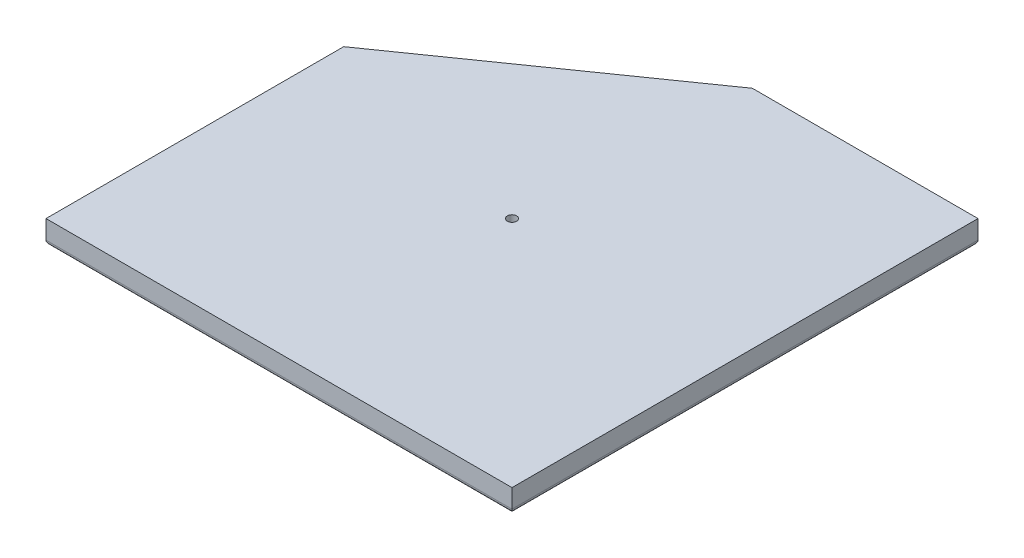
ISO-10303-21;
HEADER;
FILE_DESCRIPTION(('STEP AP214'),'2;1');
FILE_NAME('part.step','',(''),(''),'','','');
FILE_SCHEMA(('AUTOMOTIVE_DESIGN { 1 0 10303 214 1 1 1 1 }'));
ENDSEC;
DATA;
#1=APPLICATION_CONTEXT('core data for automotive mechanical design processes');
#2=APPLICATION_PROTOCOL_DEFINITION('international standard','automotive_design',2000,#1);
#3=PRODUCT_CONTEXT('',#1,'mechanical');
#4=PRODUCT('Part','Part','',(#3));
#5=PRODUCT_RELATED_PRODUCT_CATEGORY('part','',(#4));
#6=PRODUCT_DEFINITION_FORMATION('','',#4);
#7=PRODUCT_DEFINITION_CONTEXT('part definition',#1,'design');
#8=PRODUCT_DEFINITION('design','',#6,#7);
#9=PRODUCT_DEFINITION_SHAPE('','',#8);
#10=(LENGTH_UNIT() NAMED_UNIT(*) SI_UNIT(.MILLI.,.METRE.));
#11=(NAMED_UNIT(*) PLANE_ANGLE_UNIT() SI_UNIT($,.RADIAN.));
#12=(NAMED_UNIT(*) SI_UNIT($,.STERADIAN.) SOLID_ANGLE_UNIT());
#13=UNCERTAINTY_MEASURE_WITH_UNIT(LENGTH_MEASURE(1.E-05),#10,'distance_accuracy_value','');
#14=(GEOMETRIC_REPRESENTATION_CONTEXT(3) GLOBAL_UNCERTAINTY_ASSIGNED_CONTEXT((#13)) GLOBAL_UNIT_ASSIGNED_CONTEXT((#10,
#11,#12)) REPRESENTATION_CONTEXT('',''));
#15=CARTESIAN_POINT('',(0.,0.,0.));
#16=DIRECTION('',(0.,0.,1.));
#17=DIRECTION('',(1.,0.,0.));
#18=AXIS2_PLACEMENT_3D('',#15,#16,#17);
#19=CARTESIAN_POINT('',(0.,5.,0.));
#20=DIRECTION('',(1.,0.,0.));
#21=DIRECTION('',(0.,0.,-1.));
#22=AXIS2_PLACEMENT_3D('',#19,#20,#21);
#23=PLANE('',#22);
#24=DIRECTION('',(0.,-1.,0.));
#25=VECTOR('',#24,1.);
#26=CARTESIAN_POINT('',(0.,5.,-63.88575015));
#27=LINE('',#26,#25);
#28=CARTESIAN_POINT('',(0.,5.,-63.88575015));
#29=VERTEX_POINT('',#28);
#30=CARTESIAN_POINT('',(0.,1.,-63.88575015));
#31=VERTEX_POINT('',#30);
#32=EDGE_CURVE('E181',#29,#31,#27,.T.);
#33=ORIENTED_EDGE('',*,*,#32,.T.);
#34=DIRECTION('',(0.,0.,1.));
#35=VECTOR('',#34,1.);
#36=CARTESIAN_POINT('',(0.,1.,0.));
#37=LINE('',#36,#35);
#38=CARTESIAN_POINT('',(0.,1.,0.));
#39=VERTEX_POINT('',#38);
#40=EDGE_CURVE('E131',#31,#39,#37,.T.);
#41=ORIENTED_EDGE('',*,*,#40,.T.);
#42=DIRECTION('',(0.,-1.,0.));
#43=VECTOR('',#42,1.);
#44=CARTESIAN_POINT('',(0.,5.,0.));
#45=LINE('',#44,#43);
#46=CARTESIAN_POINT('',(0.,5.,0.));
#47=VERTEX_POINT('',#46);
#48=EDGE_CURVE('E113',#47,#39,#45,.T.);
#49=ORIENTED_EDGE('',*,*,#48,.F.);
#50=DIRECTION('',(0.,0.,1.));
#51=VECTOR('',#50,1.);
#52=CARTESIAN_POINT('',(0.,5.,0.));
#53=LINE('',#52,#51);
#54=EDGE_CURVE('E118',#29,#47,#53,.T.);
#55=ORIENTED_EDGE('',*,*,#54,.F.);
#56=EDGE_LOOP('',(#33,#41,#49,#55));
#57=FACE_BOUND('',#56,.T.);
#58=ADVANCED_FACE('F44',(#57),#23,.F.);
#59=CARTESIAN_POINT('',(0.,5.,0.));
#60=DIRECTION('',(0.,0.,-1.));
#61=DIRECTION('',(-1.,0.,0.));
#62=AXIS2_PLACEMENT_3D('',#59,#60,#61);
#63=PLANE('',#62);
#64=ORIENTED_EDGE('',*,*,#48,.T.);
#65=DIRECTION('',(1.,0.,0.));
#66=VECTOR('',#65,1.);
#67=CARTESIAN_POINT('',(0.,1.,0.));
#68=LINE('',#67,#66);
#69=CARTESIAN_POINT('',(100.,1.,0.));
#70=VERTEX_POINT('',#69);
#71=EDGE_CURVE('E149',#39,#70,#68,.T.);
#72=ORIENTED_EDGE('',*,*,#71,.T.);
#73=DIRECTION('',(0.,-1.,0.));
#74=VECTOR('',#73,1.);
#75=CARTESIAN_POINT('',(100.,5.,0.));
#76=LINE('',#75,#74);
#77=CARTESIAN_POINT('',(100.,5.,0.));
#78=VERTEX_POINT('',#77);
#79=EDGE_CURVE('E114',#78,#70,#76,.T.);
#80=ORIENTED_EDGE('',*,*,#79,.F.);
#81=DIRECTION('',(1.,0.,0.));
#82=VECTOR('',#81,1.);
#83=CARTESIAN_POINT('',(0.,5.,0.));
#84=LINE('',#83,#82);
#85=EDGE_CURVE('E109',#47,#78,#84,.T.);
#86=ORIENTED_EDGE('',*,*,#85,.F.);
#87=EDGE_LOOP('',(#64,#72,#80,#86));
#88=FACE_BOUND('',#87,.T.);
#89=ADVANCED_FACE('F111',(#88),#63,.F.);
#90=CARTESIAN_POINT('',(100.,5.,0.));
#91=DIRECTION('',(-1.,0.,0.));
#92=DIRECTION('',(0.,0.,1.));
#93=AXIS2_PLACEMENT_3D('',#90,#91,#92);
#94=PLANE('',#93);
#95=ORIENTED_EDGE('',*,*,#79,.T.);
#96=DIRECTION('',(0.,0.,-1.));
#97=VECTOR('',#96,1.);
#98=CARTESIAN_POINT('',(100.,1.,0.));
#99=LINE('',#98,#97);
#100=CARTESIAN_POINT('',(100.,1.,-100.));
#101=VERTEX_POINT('',#100);
#102=EDGE_CURVE('E68',#70,#101,#99,.T.);
#103=ORIENTED_EDGE('',*,*,#102,.T.);
#104=DIRECTION('',(0.,-1.,0.));
#105=VECTOR('',#104,1.);
#106=CARTESIAN_POINT('',(100.,5.,-100.));
#107=LINE('',#106,#105);
#108=CARTESIAN_POINT('',(100.,5.,-100.));
#109=VERTEX_POINT('',#108);
#110=EDGE_CURVE('E135',#109,#101,#107,.T.);
#111=ORIENTED_EDGE('',*,*,#110,.F.);
#112=DIRECTION('',(0.,0.,-1.));
#113=VECTOR('',#112,1.);
#114=CARTESIAN_POINT('',(100.,5.,0.));
#115=LINE('',#114,#113);
#116=EDGE_CURVE('E117',#78,#109,#115,.T.);
#117=ORIENTED_EDGE('',*,*,#116,.F.);
#118=EDGE_LOOP('',(#95,#103,#111,#117));
#119=FACE_BOUND('',#118,.T.);
#120=ADVANCED_FACE('F202',(#119),#94,.F.);
#121=CARTESIAN_POINT('',(100.,5.,-100.));
#122=DIRECTION('',(0.,0.,1.));
#123=DIRECTION('',(1.,0.,0.));
#124=AXIS2_PLACEMENT_3D('',#121,#122,#123);
#125=PLANE('',#124);
#126=ORIENTED_EDGE('',*,*,#110,.T.);
#127=DIRECTION('',(-1.,0.,0.));
#128=VECTOR('',#127,1.);
#129=CARTESIAN_POINT('',(100.,1.,-100.));
#130=LINE('',#129,#128);
#131=CARTESIAN_POINT('',(51.57649394,1.,-100.));
#132=VERTEX_POINT('',#131);
#133=EDGE_CURVE('E53',#101,#132,#130,.T.);
#134=ORIENTED_EDGE('',*,*,#133,.T.);
#135=DIRECTION('',(0.,-1.,0.));
#136=VECTOR('',#135,1.);
#137=CARTESIAN_POINT('',(51.57649394,5.,-100.));
#138=LINE('',#137,#136);
#139=CARTESIAN_POINT('',(51.57649394,5.,-100.));
#140=VERTEX_POINT('',#139);
#141=EDGE_CURVE('E183',#140,#132,#138,.T.);
#142=ORIENTED_EDGE('',*,*,#141,.F.);
#143=DIRECTION('',(-1.,0.,0.));
#144=VECTOR('',#143,1.);
#145=CARTESIAN_POINT('',(100.,5.,-100.));
#146=LINE('',#145,#144);
#147=EDGE_CURVE('E178',#109,#140,#146,.T.);
#148=ORIENTED_EDGE('',*,*,#147,.F.);
#149=EDGE_LOOP('',(#126,#134,#142,#148));
#150=FACE_BOUND('',#149,.T.);
#151=ADVANCED_FACE('F185',(#150),#125,.F.);
#152=CARTESIAN_POINT('',(51.57649394,5.,-100.));
#153=DIRECTION('',(0.573576436338093,0.,0.819152044298061));
#154=DIRECTION('',(0.819152044298062,0.,-0.573576436338093));
#155=AXIS2_PLACEMENT_3D('',#152,#153,#154);
#156=PLANE('',#155);
#157=ORIENTED_EDGE('',*,*,#141,.T.);
#158=DIRECTION('',(-0.819152044298062,0.,0.573576436338093));
#159=VECTOR('',#158,1.);
#160=CARTESIAN_POINT('',(51.57649394,1.,-100.));
#161=LINE('',#160,#159);
#162=EDGE_CURVE('E11',#132,#31,#161,.T.);
#163=ORIENTED_EDGE('',*,*,#162,.T.);
#164=ORIENTED_EDGE('',*,*,#32,.F.);
#165=DIRECTION('',(-0.819152044298061,0.,0.573576436338093));
#166=VECTOR('',#165,1.);
#167=CARTESIAN_POINT('',(51.57649394,5.,-100.));
#168=LINE('',#167,#166);
#169=EDGE_CURVE('E123',#140,#29,#168,.T.);
#170=ORIENTED_EDGE('',*,*,#169,.F.);
#171=EDGE_LOOP('',(#157,#163,#164,#170));
#172=FACE_BOUND('',#171,.T.);
#173=ADVANCED_FACE('F191',(#172),#156,.F.);
#174=CARTESIAN_POINT('',(0.,5.,0.));
#175=DIRECTION('',(0.,1.,0.));
#176=DIRECTION('',(0.,0.,1.));
#177=AXIS2_PLACEMENT_3D('',#174,#175,#176);
#178=PLANE('',#177);
#179=CARTESIAN_POINT('',(50.,5.,-50.));
#180=DIRECTION('',(0.,1.,0.));
#181=DIRECTION('',(0.,0.,1.));
#182=AXIS2_PLACEMENT_3D('',#179,#180,#181);
#183=CIRCLE('',#182,0.999999999999998);
#184=CARTESIAN_POINT('',(50.,5.,-49.));
#185=VERTEX_POINT('',#184);
#186=EDGE_CURVE('E127',#185,#185,#183,.T.);
#187=ORIENTED_EDGE('',*,*,#186,.F.);
#188=EDGE_LOOP('',(#187));
#189=FACE_BOUND('',#188,.T.);
#190=ORIENTED_EDGE('',*,*,#54,.T.);
#191=ORIENTED_EDGE('',*,*,#85,.T.);
#192=ORIENTED_EDGE('',*,*,#116,.T.);
#193=ORIENTED_EDGE('',*,*,#147,.T.);
#194=ORIENTED_EDGE('',*,*,#169,.T.);
#195=EDGE_LOOP('',(#190,#191,#192,#193,#194));
#196=FACE_BOUND('',#195,.T.);
#197=ADVANCED_FACE('F121',(#189,#196),#178,.T.);
#198=CARTESIAN_POINT('',(0.,0.,0.));
#199=DIRECTION('',(0.,1.,0.));
#200=DIRECTION('',(0.,0.,1.));
#201=AXIS2_PLACEMENT_3D('',#198,#199,#200);
#202=PLANE('',#201);
#203=DIRECTION('',(1.,0.,0.));
#204=VECTOR('',#203,1.);
#205=CARTESIAN_POINT('',(0.,0.,-1.));
#206=LINE('',#205,#204);
#207=CARTESIAN_POINT('',(99.,0.,-1.));
#208=VERTEX_POINT('',#207);
#209=CARTESIAN_POINT('',(1.,0.,-1.));
#210=VERTEX_POINT('',#209);
#211=EDGE_CURVE('E144',#208,#210,#206,.F.);
#212=ORIENTED_EDGE('',*,*,#211,.T.);
#213=DIRECTION('',(0.,0.,1.));
#214=VECTOR('',#213,1.);
#215=CARTESIAN_POINT('',(1.,0.,0.));
#216=LINE('',#215,#214);
#217=CARTESIAN_POINT('',(1.,0.,-63.3651830994382));
#218=VERTEX_POINT('',#217);
#219=EDGE_CURVE('E146',#210,#218,#216,.F.);
#220=ORIENTED_EDGE('',*,*,#219,.T.);
#221=DIRECTION('',(-0.819152044298062,0.,0.573576436338093));
#222=VECTOR('',#221,1.);
#223=CARTESIAN_POINT('',(-29.44290755798,0.,-42.0488297430367));
#224=LINE('',#223,#222);
#225=CARTESIAN_POINT('',(51.8917927288703,0.,-99.));
#226=VERTEX_POINT('',#225);
#227=EDGE_CURVE('E133',#218,#226,#224,.F.);
#228=ORIENTED_EDGE('',*,*,#227,.T.);
#229=DIRECTION('',(-1.,0.,0.));
#230=VECTOR('',#229,1.);
#231=CARTESIAN_POINT('',(0.,0.,-99.));
#232=LINE('',#231,#230);
#233=CARTESIAN_POINT('',(99.,0.,-99.));
#234=VERTEX_POINT('',#233);
#235=EDGE_CURVE('E140',#226,#234,#232,.F.);
#236=ORIENTED_EDGE('',*,*,#235,.T.);
#237=DIRECTION('',(0.,0.,-1.));
#238=VECTOR('',#237,1.);
#239=CARTESIAN_POINT('',(99.,0.,0.));
#240=LINE('',#239,#238);
#241=EDGE_CURVE('E142',#234,#208,#240,.F.);
#242=ORIENTED_EDGE('',*,*,#241,.T.);
#243=EDGE_LOOP('',(#212,#220,#228,#236,#242));
#244=FACE_BOUND('',#243,.T.);
#245=CARTESIAN_POINT('',(50.,0.,-50.));
#246=DIRECTION('',(0.,1.,0.));
#247=DIRECTION('',(0.,0.,1.));
#248=AXIS2_PLACEMENT_3D('',#245,#246,#247);
#249=CIRCLE('',#248,0.999999999999998);
#250=CARTESIAN_POINT('',(50.,0.,-49.));
#251=VERTEX_POINT('',#250);
#252=EDGE_CURVE('E166',#251,#251,#249,.T.);
#253=ORIENTED_EDGE('',*,*,#252,.T.);
#254=EDGE_LOOP('',(#253));
#255=FACE_BOUND('',#254,.T.);
#256=ADVANCED_FACE('F199',(#244,#255),#202,.F.);
#257=CARTESIAN_POINT('',(50.,5.,-50.));
#258=DIRECTION('',(0.,-1.,0.));
#259=DIRECTION('',(0.,0.,-1.));
#260=AXIS2_PLACEMENT_3D('',#257,#258,#259);
#261=CYLINDRICAL_SURFACE('',#260,0.999999999999998);
#262=ORIENTED_EDGE('',*,*,#186,.T.);
#263=EDGE_LOOP('',(#262));
#264=FACE_BOUND('',#263,.T.);
#265=ORIENTED_EDGE('',*,*,#252,.F.);
#266=EDGE_LOOP('',(#265));
#267=FACE_BOUND('',#266,.T.);
#268=ADVANCED_FACE('F228',(#264,#267),#261,.F.);
#269=CARTESIAN_POINT('',(100.,1.,-99.));
#270=DIRECTION('',(-1.,0.,0.));
#271=DIRECTION('',(0.,0.,1.));
#272=AXIS2_PLACEMENT_3D('',#269,#270,#271);
#273=CYLINDRICAL_SURFACE('',#272,1.);
#274=CARTESIAN_POINT('',(51.8917927288703,1.,-99.));
#275=DIRECTION('',(-0.953716950750604,0.,0.300705799496733));
#276=DIRECTION('',(0.300705799496733,0.,0.953716950750605));
#277=AXIS2_PLACEMENT_3D('',#274,#275,#276);
#278=ELLIPSE('',#277,1.0485291251382,1.);
#279=EDGE_CURVE('E159',#132,#226,#278,.T.);
#280=ORIENTED_EDGE('',*,*,#279,.F.);
#281=ORIENTED_EDGE('',*,*,#133,.F.);
#282=CARTESIAN_POINT('',(99.,1.,-99.));
#283=DIRECTION('',(-0.707106781186547,0.,-0.707106781186547));
#284=DIRECTION('',(-0.707106781186547,0.,0.707106781186547));
#285=AXIS2_PLACEMENT_3D('',#282,#283,#284);
#286=ELLIPSE('',#285,1.41421356237309,1.);
#287=EDGE_CURVE('E48',#234,#101,#286,.F.);
#288=ORIENTED_EDGE('',*,*,#287,.F.);
#289=ORIENTED_EDGE('',*,*,#235,.F.);
#290=EDGE_LOOP('',(#280,#281,#288,#289));
#291=FACE_BOUND('',#290,.T.);
#292=ADVANCED_FACE('F46',(#291),#273,.T.);
#293=CARTESIAN_POINT('',(99.,1.,0.));
#294=DIRECTION('',(0.,0.,-1.));
#295=DIRECTION('',(-1.,0.,0.));
#296=AXIS2_PLACEMENT_3D('',#293,#294,#295);
#297=CYLINDRICAL_SURFACE('',#296,1.);
#298=ORIENTED_EDGE('',*,*,#287,.T.);
#299=ORIENTED_EDGE('',*,*,#102,.F.);
#300=CARTESIAN_POINT('',(99.,1.,-1.));
#301=DIRECTION('',(0.707106781186547,0.,-0.707106781186547));
#302=DIRECTION('',(-0.707106781186547,0.,-0.707106781186547));
#303=AXIS2_PLACEMENT_3D('',#300,#301,#302);
#304=ELLIPSE('',#303,1.41421356237309,1.);
#305=EDGE_CURVE('E157',#208,#70,#304,.F.);
#306=ORIENTED_EDGE('',*,*,#305,.F.);
#307=ORIENTED_EDGE('',*,*,#241,.F.);
#308=EDGE_LOOP('',(#298,#299,#306,#307));
#309=FACE_BOUND('',#308,.T.);
#310=ADVANCED_FACE('F223',(#309),#297,.T.);
#311=CARTESIAN_POINT('',(52.1500703763381,1.,-99.1808479557019));
#312=DIRECTION('',(-0.819152044298062,0.,0.573576436338093));
#313=DIRECTION('',(0.573576436338093,0.,0.819152044298061));
#314=AXIS2_PLACEMENT_3D('',#311,#312,#313);
#315=CYLINDRICAL_SURFACE('',#314,1.);
#316=ORIENTED_EDGE('',*,*,#279,.T.);
#317=ORIENTED_EDGE('',*,*,#227,.F.);
#318=CARTESIAN_POINT('',(1.,1.,-63.3651830994382));
#319=DIRECTION('',(-0.461748613242047,0.,0.887010833174571));
#320=DIRECTION('',(-0.887010833174571,0.,-0.461748613242047));
#321=AXIS2_PLACEMENT_3D('',#318,#319,#320);
#322=ELLIPSE('',#321,1.12738194687098,1.);
#323=EDGE_CURVE('E155',#31,#218,#322,.T.);
#324=ORIENTED_EDGE('',*,*,#323,.F.);
#325=ORIENTED_EDGE('',*,*,#162,.F.);
#326=EDGE_LOOP('',(#316,#317,#324,#325));
#327=FACE_BOUND('',#326,.T.);
#328=ADVANCED_FACE('F189',(#327),#315,.T.);
#329=CARTESIAN_POINT('',(0.,1.,-1.));
#330=DIRECTION('',(1.,0.,0.));
#331=DIRECTION('',(0.,0.,-1.));
#332=AXIS2_PLACEMENT_3D('',#329,#330,#331);
#333=CYLINDRICAL_SURFACE('',#332,1.);
#334=ORIENTED_EDGE('',*,*,#305,.T.);
#335=ORIENTED_EDGE('',*,*,#71,.F.);
#336=CARTESIAN_POINT('',(1.,1.,-1.));
#337=DIRECTION('',(0.707106781186547,0.,0.707106781186547));
#338=DIRECTION('',(0.707106781186547,0.,-0.707106781186547));
#339=AXIS2_PLACEMENT_3D('',#336,#337,#338);
#340=ELLIPSE('',#339,1.41421356237309,1.);
#341=EDGE_CURVE('E153',#210,#39,#340,.F.);
#342=ORIENTED_EDGE('',*,*,#341,.F.);
#343=ORIENTED_EDGE('',*,*,#211,.F.);
#344=EDGE_LOOP('',(#334,#335,#342,#343));
#345=FACE_BOUND('',#344,.T.);
#346=ADVANCED_FACE('F217',(#345),#333,.T.);
#347=CARTESIAN_POINT('',(1.,1.,0.));
#348=DIRECTION('',(0.,0.,1.));
#349=DIRECTION('',(1.,0.,0.));
#350=AXIS2_PLACEMENT_3D('',#347,#348,#349);
#351=CYLINDRICAL_SURFACE('',#350,1.);
#352=ORIENTED_EDGE('',*,*,#323,.T.);
#353=ORIENTED_EDGE('',*,*,#219,.F.);
#354=ORIENTED_EDGE('',*,*,#341,.T.);
#355=ORIENTED_EDGE('',*,*,#40,.F.);
#356=EDGE_LOOP('',(#352,#353,#354,#355));
#357=FACE_BOUND('',#356,.T.);
#358=ADVANCED_FACE('F214',(#357),#351,.T.);
#359=CLOSED_SHELL('',(#58,#89,#120,#151,#173,#197,#256,#268,#292,#310,#328,#346,#358));
#360=MANIFOLD_SOLID_BREP('B2',#359);
#361=ADVANCED_BREP_SHAPE_REPRESENTATION('',(#18,#360),#14);
#362=SHAPE_DEFINITION_REPRESENTATION(#9,#361);
ENDSEC;
END-ISO-10303-21;
